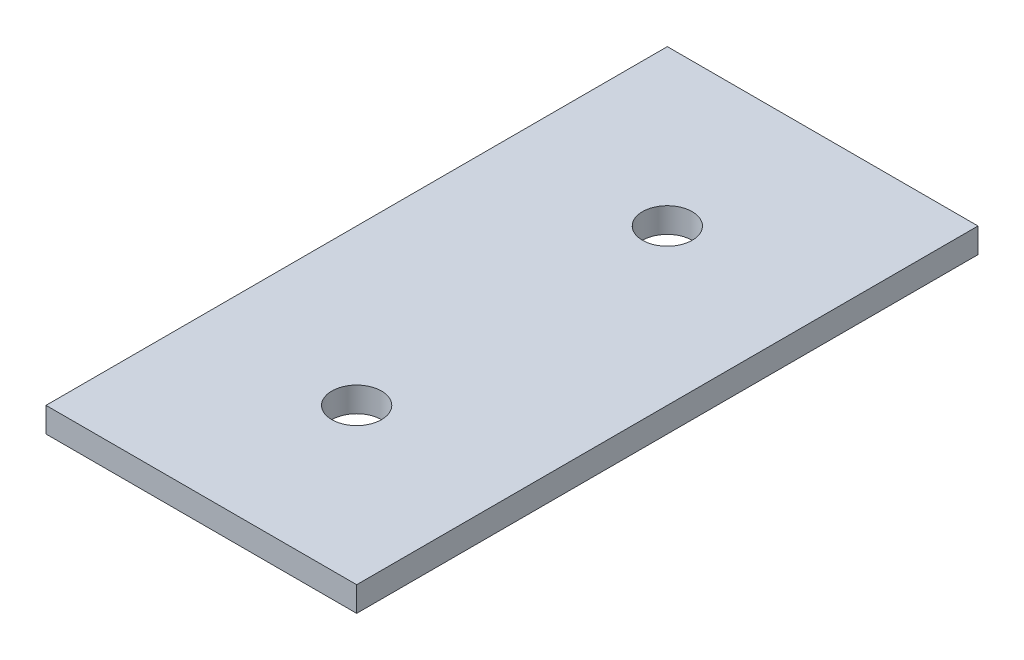
ISO-10303-21;
HEADER;
FILE_DESCRIPTION(('STEP AP214'),'2;1');
FILE_NAME('part.step','',(''),(''),'','','');
FILE_SCHEMA(('AUTOMOTIVE_DESIGN { 1 0 10303 214 1 1 1 1 }'));
ENDSEC;
DATA;
#1=APPLICATION_CONTEXT('core data for automotive mechanical design processes');
#2=APPLICATION_PROTOCOL_DEFINITION('international standard','automotive_design',2000,#1);
#3=PRODUCT_CONTEXT('',#1,'mechanical');
#4=PRODUCT('Part','Part','',(#3));
#5=PRODUCT_RELATED_PRODUCT_CATEGORY('part','',(#4));
#6=PRODUCT_DEFINITION_FORMATION('','',#4);
#7=PRODUCT_DEFINITION_CONTEXT('part definition',#1,'design');
#8=PRODUCT_DEFINITION('design','',#6,#7);
#9=PRODUCT_DEFINITION_SHAPE('','',#8);
#10=(LENGTH_UNIT() NAMED_UNIT(*) SI_UNIT(.MILLI.,.METRE.));
#11=(NAMED_UNIT(*) PLANE_ANGLE_UNIT() SI_UNIT($,.RADIAN.));
#12=(NAMED_UNIT(*) SI_UNIT($,.STERADIAN.) SOLID_ANGLE_UNIT());
#13=UNCERTAINTY_MEASURE_WITH_UNIT(LENGTH_MEASURE(1.E-05),#10,'distance_accuracy_value','');
#14=(GEOMETRIC_REPRESENTATION_CONTEXT(3) GLOBAL_UNCERTAINTY_ASSIGNED_CONTEXT((#13)) GLOBAL_UNIT_ASSIGNED_CONTEXT((#10,
#11,#12)) REPRESENTATION_CONTEXT('',''));
#15=CARTESIAN_POINT('',(0.,0.,0.));
#16=DIRECTION('',(0.,0.,1.));
#17=DIRECTION('',(1.,0.,0.));
#18=AXIS2_PLACEMENT_3D('',#15,#16,#17);
#19=CARTESIAN_POINT('',(0.,4.,0.));
#20=DIRECTION('',(1.,0.,0.));
#21=DIRECTION('',(0.,0.,-1.));
#22=AXIS2_PLACEMENT_3D('',#19,#20,#21);
#23=PLANE('',#22);
#24=DIRECTION('',(0.,0.,1.));
#25=VECTOR('',#24,1.);
#26=CARTESIAN_POINT('',(0.,0.,0.));
#27=LINE('',#26,#25);
#28=CARTESIAN_POINT('',(0.,0.,-100.));
#29=VERTEX_POINT('',#28);
#30=CARTESIAN_POINT('',(0.,0.,0.));
#31=VERTEX_POINT('',#30);
#32=EDGE_CURVE('E103',#29,#31,#27,.T.);
#33=ORIENTED_EDGE('',*,*,#32,.T.);
#34=DIRECTION('',(0.,-1.,0.));
#35=VECTOR('',#34,1.);
#36=CARTESIAN_POINT('',(0.,4.,0.));
#37=LINE('',#36,#35);
#38=CARTESIAN_POINT('',(0.,4.,0.));
#39=VERTEX_POINT('',#38);
#40=EDGE_CURVE('E11',#39,#31,#37,.T.);
#41=ORIENTED_EDGE('',*,*,#40,.F.);
#42=DIRECTION('',(0.,0.,1.));
#43=VECTOR('',#42,1.);
#44=CARTESIAN_POINT('',(0.,4.,0.));
#45=LINE('',#44,#43);
#46=CARTESIAN_POINT('',(0.,4.,-100.));
#47=VERTEX_POINT('',#46);
#48=EDGE_CURVE('E91',#47,#39,#45,.T.);
#49=ORIENTED_EDGE('',*,*,#48,.F.);
#50=DIRECTION('',(0.,-1.,0.));
#51=VECTOR('',#50,1.);
#52=CARTESIAN_POINT('',(0.,4.,-100.));
#53=LINE('',#52,#51);
#54=EDGE_CURVE('E99',#47,#29,#53,.T.);
#55=ORIENTED_EDGE('',*,*,#54,.T.);
#56=EDGE_LOOP('',(#33,#41,#49,#55));
#57=FACE_BOUND('',#56,.T.);
#58=ADVANCED_FACE('F40',(#57),#23,.F.);
#59=CARTESIAN_POINT('',(0.,4.,0.));
#60=DIRECTION('',(0.,0.,-1.));
#61=DIRECTION('',(-1.,0.,0.));
#62=AXIS2_PLACEMENT_3D('',#59,#60,#61);
#63=PLANE('',#62);
#64=DIRECTION('',(1.,0.,0.));
#65=VECTOR('',#64,1.);
#66=CARTESIAN_POINT('',(0.,0.,0.));
#67=LINE('',#66,#65);
#68=CARTESIAN_POINT('',(50.,0.,0.));
#69=VERTEX_POINT('',#68);
#70=EDGE_CURVE('E95',#31,#69,#67,.T.);
#71=ORIENTED_EDGE('',*,*,#70,.T.);
#72=DIRECTION('',(0.,-1.,0.));
#73=VECTOR('',#72,1.);
#74=CARTESIAN_POINT('',(50.,4.,0.));
#75=LINE('',#74,#73);
#76=CARTESIAN_POINT('',(50.,4.,0.));
#77=VERTEX_POINT('',#76);
#78=EDGE_CURVE('E48',#77,#69,#75,.T.);
#79=ORIENTED_EDGE('',*,*,#78,.F.);
#80=DIRECTION('',(1.,0.,0.));
#81=VECTOR('',#80,1.);
#82=CARTESIAN_POINT('',(0.,4.,0.));
#83=LINE('',#82,#81);
#84=EDGE_CURVE('E86',#39,#77,#83,.T.);
#85=ORIENTED_EDGE('',*,*,#84,.F.);
#86=ORIENTED_EDGE('',*,*,#40,.T.);
#87=EDGE_LOOP('',(#71,#79,#85,#86));
#88=FACE_BOUND('',#87,.T.);
#89=ADVANCED_FACE('F94',(#88),#63,.F.);
#90=CARTESIAN_POINT('',(50.,4.,0.));
#91=DIRECTION('',(-1.,0.,0.));
#92=DIRECTION('',(0.,0.,1.));
#93=AXIS2_PLACEMENT_3D('',#90,#91,#92);
#94=PLANE('',#93);
#95=DIRECTION('',(0.,0.,-1.));
#96=VECTOR('',#95,1.);
#97=CARTESIAN_POINT('',(50.,0.,0.));
#98=LINE('',#97,#96);
#99=CARTESIAN_POINT('',(50.,0.,-100.));
#100=VERTEX_POINT('',#99);
#101=EDGE_CURVE('E73',#69,#100,#98,.T.);
#102=ORIENTED_EDGE('',*,*,#101,.T.);
#103=DIRECTION('',(0.,-1.,0.));
#104=VECTOR('',#103,1.);
#105=CARTESIAN_POINT('',(50.,4.,-100.));
#106=LINE('',#105,#104);
#107=CARTESIAN_POINT('',(50.,4.,-100.));
#108=VERTEX_POINT('',#107);
#109=EDGE_CURVE('E96',#108,#100,#106,.T.);
#110=ORIENTED_EDGE('',*,*,#109,.F.);
#111=DIRECTION('',(0.,0.,-1.));
#112=VECTOR('',#111,1.);
#113=CARTESIAN_POINT('',(50.,4.,0.));
#114=LINE('',#113,#112);
#115=EDGE_CURVE('E89',#77,#108,#114,.T.);
#116=ORIENTED_EDGE('',*,*,#115,.F.);
#117=ORIENTED_EDGE('',*,*,#78,.T.);
#118=EDGE_LOOP('',(#102,#110,#116,#117));
#119=FACE_BOUND('',#118,.T.);
#120=ADVANCED_FACE('F97',(#119),#94,.F.);
#121=CARTESIAN_POINT('',(0.,4.,-100.));
#122=DIRECTION('',(0.,0.,1.));
#123=DIRECTION('',(1.,0.,0.));
#124=AXIS2_PLACEMENT_3D('',#121,#122,#123);
#125=PLANE('',#124);
#126=DIRECTION('',(-1.,0.,0.));
#127=VECTOR('',#126,1.);
#128=CARTESIAN_POINT('',(0.,0.,-100.));
#129=LINE('',#128,#127);
#130=EDGE_CURVE('E79',#100,#29,#129,.T.);
#131=ORIENTED_EDGE('',*,*,#130,.T.);
#132=ORIENTED_EDGE('',*,*,#54,.F.);
#133=DIRECTION('',(-1.,0.,0.));
#134=VECTOR('',#133,1.);
#135=CARTESIAN_POINT('',(0.,4.,-100.));
#136=LINE('',#135,#134);
#137=EDGE_CURVE('E56',#108,#47,#136,.T.);
#138=ORIENTED_EDGE('',*,*,#137,.F.);
#139=ORIENTED_EDGE('',*,*,#109,.T.);
#140=EDGE_LOOP('',(#131,#132,#138,#139));
#141=FACE_BOUND('',#140,.T.);
#142=ADVANCED_FACE('F111',(#141),#125,.F.);
#143=CARTESIAN_POINT('',(0.,4.,0.));
#144=DIRECTION('',(0.,-1.,0.));
#145=DIRECTION('',(0.,0.,-1.));
#146=AXIS2_PLACEMENT_3D('',#143,#144,#145);
#147=PLANE('',#146);
#148=CARTESIAN_POINT('',(25.,4.,-75.));
#149=DIRECTION('',(0.,1.,0.));
#150=DIRECTION('',(0.,0.,1.));
#151=AXIS2_PLACEMENT_3D('',#148,#149,#150);
#152=CIRCLE('',#151,4.);
#153=CARTESIAN_POINT('',(25.,4.,-71.));
#154=VERTEX_POINT('',#153);
#155=EDGE_CURVE('E123',#154,#154,#152,.T.);
#156=ORIENTED_EDGE('',*,*,#155,.F.);
#157=EDGE_LOOP('',(#156));
#158=FACE_BOUND('',#157,.T.);
#159=CARTESIAN_POINT('',(25.,4.,-25.));
#160=DIRECTION('',(0.,1.,0.));
#161=DIRECTION('',(0.,0.,1.));
#162=AXIS2_PLACEMENT_3D('',#159,#160,#161);
#163=CIRCLE('',#162,3.99999999999999);
#164=CARTESIAN_POINT('',(25.,4.,-21.));
#165=VERTEX_POINT('',#164);
#166=EDGE_CURVE('E117',#165,#165,#163,.T.);
#167=ORIENTED_EDGE('',*,*,#166,.F.);
#168=EDGE_LOOP('',(#167));
#169=FACE_BOUND('',#168,.T.);
#170=ORIENTED_EDGE('',*,*,#48,.T.);
#171=ORIENTED_EDGE('',*,*,#84,.T.);
#172=ORIENTED_EDGE('',*,*,#115,.T.);
#173=ORIENTED_EDGE('',*,*,#137,.T.);
#174=EDGE_LOOP('',(#170,#171,#172,#173));
#175=FACE_BOUND('',#174,.T.);
#176=ADVANCED_FACE('F87',(#158,#169,#175),#147,.F.);
#177=CARTESIAN_POINT('',(0.,0.,0.));
#178=DIRECTION('',(0.,-1.,0.));
#179=DIRECTION('',(0.,0.,-1.));
#180=AXIS2_PLACEMENT_3D('',#177,#178,#179);
#181=PLANE('',#180);
#182=CARTESIAN_POINT('',(25.,0.,-75.));
#183=DIRECTION('',(0.,1.,0.));
#184=DIRECTION('',(0.,0.,1.));
#185=AXIS2_PLACEMENT_3D('',#182,#183,#184);
#186=CIRCLE('',#185,4.);
#187=CARTESIAN_POINT('',(25.,0.,-71.));
#188=VERTEX_POINT('',#187);
#189=EDGE_CURVE('E106',#188,#188,#186,.T.);
#190=ORIENTED_EDGE('',*,*,#189,.T.);
#191=EDGE_LOOP('',(#190));
#192=FACE_BOUND('',#191,.T.);
#193=CARTESIAN_POINT('',(25.,0.,-25.));
#194=DIRECTION('',(0.,1.,0.));
#195=DIRECTION('',(0.,0.,1.));
#196=AXIS2_PLACEMENT_3D('',#193,#194,#195);
#197=CIRCLE('',#196,3.99999999999999);
#198=CARTESIAN_POINT('',(25.,0.,-21.));
#199=VERTEX_POINT('',#198);
#200=EDGE_CURVE('E120',#199,#199,#197,.T.);
#201=ORIENTED_EDGE('',*,*,#200,.T.);
#202=EDGE_LOOP('',(#201));
#203=FACE_BOUND('',#202,.T.);
#204=ORIENTED_EDGE('',*,*,#32,.F.);
#205=ORIENTED_EDGE('',*,*,#130,.F.);
#206=ORIENTED_EDGE('',*,*,#101,.F.);
#207=ORIENTED_EDGE('',*,*,#70,.F.);
#208=EDGE_LOOP('',(#204,#205,#206,#207));
#209=FACE_BOUND('',#208,.T.);
#210=ADVANCED_FACE('F114',(#192,#203,#209),#181,.T.);
#211=CARTESIAN_POINT('',(25.,0.,-25.));
#212=DIRECTION('',(0.,1.,0.));
#213=DIRECTION('',(0.,0.,1.));
#214=AXIS2_PLACEMENT_3D('',#211,#212,#213);
#215=CYLINDRICAL_SURFACE('',#214,3.99999999999999);
#216=ORIENTED_EDGE('',*,*,#200,.F.);
#217=EDGE_LOOP('',(#216));
#218=FACE_BOUND('',#217,.T.);
#219=ORIENTED_EDGE('',*,*,#166,.T.);
#220=EDGE_LOOP('',(#219));
#221=FACE_BOUND('',#220,.T.);
#222=ADVANCED_FACE('F134',(#218,#221),#215,.F.);
#223=CARTESIAN_POINT('',(25.,0.,-75.));
#224=DIRECTION('',(0.,1.,0.));
#225=DIRECTION('',(0.,0.,1.));
#226=AXIS2_PLACEMENT_3D('',#223,#224,#225);
#227=CYLINDRICAL_SURFACE('',#226,4.);
#228=ORIENTED_EDGE('',*,*,#189,.F.);
#229=EDGE_LOOP('',(#228));
#230=FACE_BOUND('',#229,.T.);
#231=ORIENTED_EDGE('',*,*,#155,.T.);
#232=EDGE_LOOP('',(#231));
#233=FACE_BOUND('',#232,.T.);
#234=ADVANCED_FACE('F131',(#230,#233),#227,.F.);
#235=CLOSED_SHELL('',(#58,#89,#120,#142,#176,#210,#222,#234));
#236=MANIFOLD_SOLID_BREP('B2',#235);
#237=ADVANCED_BREP_SHAPE_REPRESENTATION('',(#18,#236),#14);
#238=SHAPE_DEFINITION_REPRESENTATION(#9,#237);
ENDSEC;
END-ISO-10303-21;
